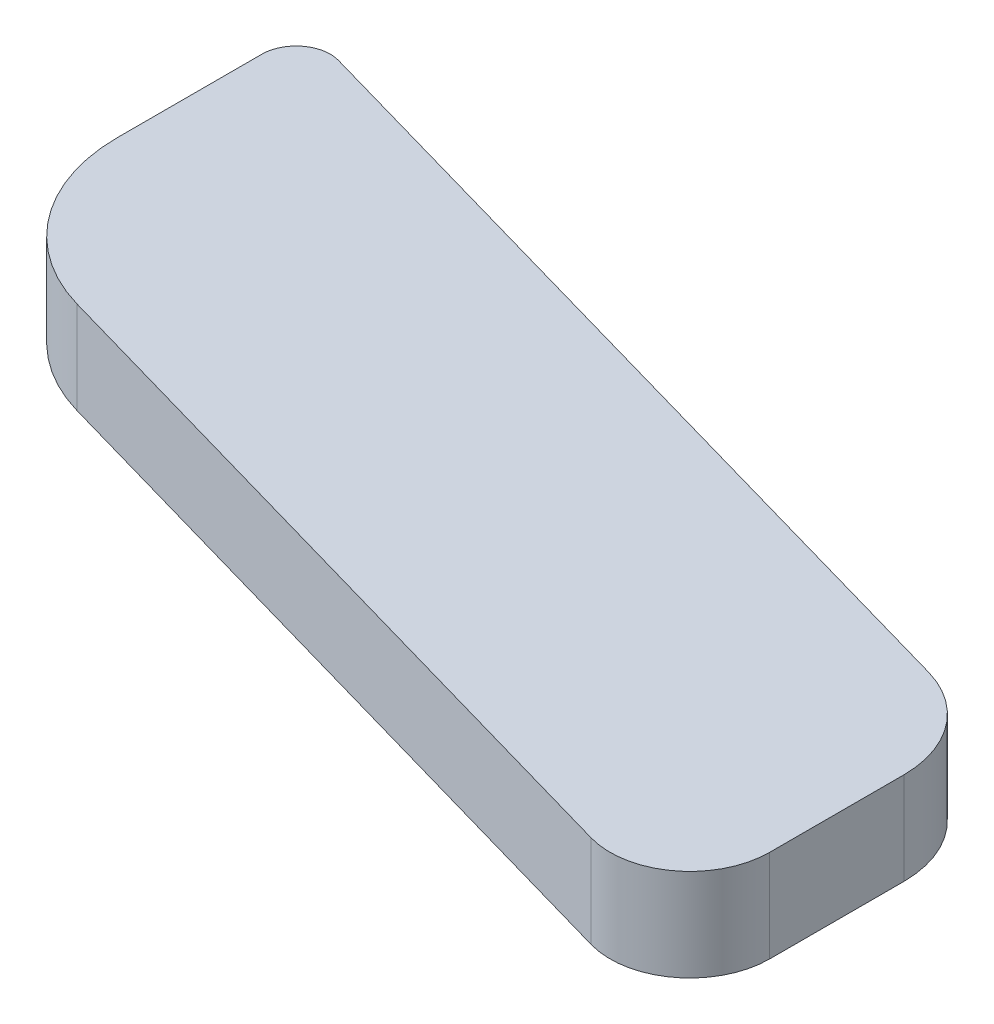
ISO-10303-21;
HEADER;
FILE_DESCRIPTION(('STEP AP214'),'2;1');
FILE_NAME('part.step','',(''),(''),'','','');
FILE_SCHEMA(('AUTOMOTIVE_DESIGN { 1 0 10303 214 1 1 1 1 }'));
ENDSEC;
DATA;
#1=APPLICATION_CONTEXT('core data for automotive mechanical design processes');
#2=APPLICATION_PROTOCOL_DEFINITION('international standard','automotive_design',2000,#1);
#3=PRODUCT_CONTEXT('',#1,'mechanical');
#4=PRODUCT('Part','Part','',(#3));
#5=PRODUCT_RELATED_PRODUCT_CATEGORY('part','',(#4));
#6=PRODUCT_DEFINITION_FORMATION('','',#4);
#7=PRODUCT_DEFINITION_CONTEXT('part definition',#1,'design');
#8=PRODUCT_DEFINITION('design','',#6,#7);
#9=PRODUCT_DEFINITION_SHAPE('','',#8);
#10=(LENGTH_UNIT() NAMED_UNIT(*) SI_UNIT(.MILLI.,.METRE.));
#11=(NAMED_UNIT(*) PLANE_ANGLE_UNIT() SI_UNIT($,.RADIAN.));
#12=(NAMED_UNIT(*) SI_UNIT($,.STERADIAN.) SOLID_ANGLE_UNIT());
#13=UNCERTAINTY_MEASURE_WITH_UNIT(LENGTH_MEASURE(1.E-05),#10,'distance_accuracy_value','');
#14=(GEOMETRIC_REPRESENTATION_CONTEXT(3) GLOBAL_UNCERTAINTY_ASSIGNED_CONTEXT((#13)) GLOBAL_UNIT_ASSIGNED_CONTEXT((#10,
#11,#12)) REPRESENTATION_CONTEXT('',''));
#15=CARTESIAN_POINT('',(0.,0.,0.));
#16=DIRECTION('',(0.,0.,1.));
#17=DIRECTION('',(1.,0.,0.));
#18=AXIS2_PLACEMENT_3D('',#15,#16,#17);
#19=CARTESIAN_POINT('',(-0.721252074815928,2.9906,0.232990299906857));
#20=DIRECTION('',(0.,-1.,0.));
#21=DIRECTION('',(-1.,0.,0.));
#22=AXIS2_PLACEMENT_3D('',#19,#20,#21);
#23=CYLINDRICAL_SURFACE('',#22,0.111091614503659);
#24=CARTESIAN_POINT('',(-0.721252074815928,2.9906,0.232990299906857));
#25=DIRECTION('',(0.,1.,0.));
#26=DIRECTION('',(1.,0.,0.));
#27=AXIS2_PLACEMENT_3D('',#24,#25,#26);
#28=CIRCLE('',#27,0.111091614503659);
#29=CARTESIAN_POINT('',(-0.832343689319588,2.9906,0.232990299906857));
#30=VERTEX_POINT('',#29);
#31=CARTESIAN_POINT('',(-0.75173687021393,2.9906,0.339817375419443));
#32=VERTEX_POINT('',#31);
#33=EDGE_CURVE('E11',#30,#32,#28,.T.);
#34=ORIENTED_EDGE('',*,*,#33,.F.);
#35=DIRECTION('',(0.,-1.,0.));
#36=VECTOR('',#35,1.);
#37=CARTESIAN_POINT('',(-0.832343689319588,2.9906,0.232990299906857));
#38=LINE('',#37,#36);
#39=CARTESIAN_POINT('',(-0.832343689319588,2.9306,0.232990299906857));
#40=VERTEX_POINT('',#39);
#41=EDGE_CURVE('E24',#30,#40,#38,.T.);
#42=ORIENTED_EDGE('',*,*,#41,.T.);
#43=CARTESIAN_POINT('',(-0.721252074815928,2.9306,0.232990299906857));
#44=DIRECTION('',(0.,1.,0.));
#45=DIRECTION('',(1.,0.,0.));
#46=AXIS2_PLACEMENT_3D('',#43,#44,#45);
#47=CIRCLE('',#46,0.111091614503659);
#48=CARTESIAN_POINT('',(-0.75173687021393,2.9306,0.339817375419443));
#49=VERTEX_POINT('',#48);
#50=EDGE_CURVE('E157',#40,#49,#47,.T.);
#51=ORIENTED_EDGE('',*,*,#50,.T.);
#52=DIRECTION('',(0.,-1.,0.));
#53=VECTOR('',#52,1.);
#54=CARTESIAN_POINT('',(-0.75173687021393,2.9906,0.339817375419443));
#55=LINE('',#54,#53);
#56=EDGE_CURVE('E154',#32,#49,#55,.T.);
#57=ORIENTED_EDGE('',*,*,#56,.F.);
#58=EDGE_LOOP('',(#34,#42,#51,#57));
#59=FACE_BOUND('',#58,.T.);
#60=ADVANCED_FACE('F17',(#59),#23,.T.);
#61=CARTESIAN_POINT('',(-0.286722062113019,2.9906,0.336160147220718));
#62=DIRECTION('',(0.,-1.,0.));
#63=DIRECTION('',(-1.,0.,0.));
#64=AXIS2_PLACEMENT_3D('',#61,#62,#63);
#65=CYLINDRICAL_SURFACE('',#64,0.0684324345343284);
#66=CARTESIAN_POINT('',(-0.286722062113019,2.9306,0.336160147220718));
#67=DIRECTION('',(0.,1.,0.));
#68=DIRECTION('',(1.,0.,0.));
#69=AXIS2_PLACEMENT_3D('',#66,#67,#68);
#70=CIRCLE('',#69,0.0684324345343284);
#71=CARTESIAN_POINT('',(-0.218289627578691,2.9306,0.336160147220688));
#72=VERTEX_POINT('',#71);
#73=CARTESIAN_POINT('',(-0.26798909429343,2.9306,0.270341654280167));
#74=VERTEX_POINT('',#73);
#75=EDGE_CURVE('E152',#72,#74,#70,.T.);
#76=ORIENTED_EDGE('',*,*,#75,.T.);
#77=DIRECTION('',(0.,-1.,0.));
#78=VECTOR('',#77,1.);
#79=CARTESIAN_POINT('',(-0.26798909429343,2.9906,0.270341654280167));
#80=LINE('',#79,#78);
#81=CARTESIAN_POINT('',(-0.26798909429343,2.9906,0.270341654280167));
#82=VERTEX_POINT('',#81);
#83=EDGE_CURVE('E149',#82,#74,#80,.T.);
#84=ORIENTED_EDGE('',*,*,#83,.F.);
#85=CARTESIAN_POINT('',(-0.286722062113019,2.9906,0.336160147220718));
#86=DIRECTION('',(0.,1.,0.));
#87=DIRECTION('',(1.,0.,0.));
#88=AXIS2_PLACEMENT_3D('',#85,#86,#87);
#89=CIRCLE('',#88,0.0684324345343284);
#90=CARTESIAN_POINT('',(-0.218289627578691,2.9906,0.336160147220688));
#91=VERTEX_POINT('',#90);
#92=EDGE_CURVE('E147',#91,#82,#89,.T.);
#93=ORIENTED_EDGE('',*,*,#92,.F.);
#94=DIRECTION('',(0.,-1.,0.));
#95=VECTOR('',#94,1.);
#96=CARTESIAN_POINT('',(-0.218289627578691,2.9906,0.336160147220688));
#97=LINE('',#96,#95);
#98=EDGE_CURVE('E107',#91,#72,#97,.T.);
#99=ORIENTED_EDGE('',*,*,#98,.T.);
#100=EDGE_LOOP('',(#76,#84,#93,#99));
#101=FACE_BOUND('',#100,.T.);
#102=ADVANCED_FACE('F179',(#101),#65,.T.);
#103=CARTESIAN_POINT('',(-0.26798909429343,2.9906,0.270341654280167));
#104=DIRECTION('',(-0.273743992115519,0.,0.96180259241731));
#105=DIRECTION('',(0.96180259241731,0.,0.273743992115519));
#106=AXIS2_PLACEMENT_3D('',#103,#104,#105);
#107=PLANE('',#106);
#108=DIRECTION('',(-0.96180259241731,0.,-0.273743992115519));
#109=VECTOR('',#108,1.);
#110=CARTESIAN_POINT('',(-0.26798909429343,2.9306,0.270341654280167));
#111=LINE('',#110,#109);
#112=CARTESIAN_POINT('',(-0.804033523518037,2.9306,0.117775064042113));
#113=VERTEX_POINT('',#112);
#114=EDGE_CURVE('E144',#74,#113,#111,.T.);
#115=ORIENTED_EDGE('',*,*,#114,.T.);
#116=DIRECTION('',(0.,-1.,0.));
#117=VECTOR('',#116,1.);
#118=CARTESIAN_POINT('',(-0.804033523518037,2.9906,0.117775064042113));
#119=LINE('',#118,#117);
#120=CARTESIAN_POINT('',(-0.804033523518037,2.9906,0.117775064042113));
#121=VERTEX_POINT('',#120);
#122=EDGE_CURVE('E141',#121,#113,#119,.T.);
#123=ORIENTED_EDGE('',*,*,#122,.F.);
#124=DIRECTION('',(-0.96180259241731,0.,-0.273743992115519));
#125=VECTOR('',#124,1.);
#126=CARTESIAN_POINT('',(-0.26798909429343,2.9906,0.270341654280167));
#127=LINE('',#126,#125);
#128=EDGE_CURVE('E138',#82,#121,#127,.T.);
#129=ORIENTED_EDGE('',*,*,#128,.F.);
#130=ORIENTED_EDGE('',*,*,#83,.T.);
#131=EDGE_LOOP('',(#115,#123,#129,#130));
#132=FACE_BOUND('',#131,.T.);
#133=ADVANCED_FACE('F177',(#132),#107,.F.);
#134=CARTESIAN_POINT('',(-0.810115655926985,2.9906,0.139144704607261));
#135=DIRECTION('',(0.,-1.,0.));
#136=DIRECTION('',(-1.,0.,0.));
#137=AXIS2_PLACEMENT_3D('',#134,#135,#136);
#138=CYLINDRICAL_SURFACE('',#137,0.022218322900786);
#139=CARTESIAN_POINT('',(-0.810115655926985,2.9306,0.139144704607261));
#140=DIRECTION('',(0.,1.,0.));
#141=DIRECTION('',(1.,0.,0.));
#142=AXIS2_PLACEMENT_3D('',#139,#140,#141);
#143=CIRCLE('',#142,0.022218322900786);
#144=CARTESIAN_POINT('',(-0.832333978708818,2.9306,0.139142405496553));
#145=VERTEX_POINT('',#144);
#146=EDGE_CURVE('E136',#113,#145,#143,.T.);
#147=ORIENTED_EDGE('',*,*,#146,.T.);
#148=DIRECTION('',(0.,-1.,0.));
#149=VECTOR('',#148,1.);
#150=CARTESIAN_POINT('',(-0.832333978708818,2.9906,0.139142405496553));
#151=LINE('',#150,#149);
#152=CARTESIAN_POINT('',(-0.832333978708818,2.9906,0.139142405496553));
#153=VERTEX_POINT('',#152);
#154=EDGE_CURVE('E133',#153,#145,#151,.T.);
#155=ORIENTED_EDGE('',*,*,#154,.F.);
#156=CARTESIAN_POINT('',(-0.810115655926985,2.9906,0.139144704607261));
#157=DIRECTION('',(0.,1.,0.));
#158=DIRECTION('',(1.,0.,0.));
#159=AXIS2_PLACEMENT_3D('',#156,#157,#158);
#160=CIRCLE('',#159,0.022218322900786);
#161=EDGE_CURVE('E130',#121,#153,#160,.T.);
#162=ORIENTED_EDGE('',*,*,#161,.F.);
#163=ORIENTED_EDGE('',*,*,#122,.T.);
#164=EDGE_LOOP('',(#147,#155,#162,#163));
#165=FACE_BOUND('',#164,.T.);
#166=ADVANCED_FACE('F173',(#165),#138,.T.);
#167=CARTESIAN_POINT('',(-0.832333978708818,2.9906,0.139142405496553));
#168=DIRECTION('',(0.999999994646137,0.,0.000103478139249879));
#169=DIRECTION('',(0.000103478139249879,0.,-0.999999994646137));
#170=AXIS2_PLACEMENT_3D('',#167,#168,#169);
#171=PLANE('',#170);
#172=DIRECTION('',(-0.000103478139249879,0.,0.999999994646137));
#173=VECTOR('',#172,1.);
#174=CARTESIAN_POINT('',(-0.832333978708818,2.9306,0.139142405496553));
#175=LINE('',#174,#173);
#176=CARTESIAN_POINT('',(-0.832343688724818,2.9306,0.232978804353251));
#177=VERTEX_POINT('',#176);
#178=EDGE_CURVE('E128',#145,#177,#175,.T.);
#179=ORIENTED_EDGE('',*,*,#178,.T.);
#180=DIRECTION('',(0.,-1.,0.));
#181=VECTOR('',#180,1.);
#182=CARTESIAN_POINT('',(-0.832343688724818,2.9906,0.232978804353251));
#183=LINE('',#182,#181);
#184=CARTESIAN_POINT('',(-0.832343688724818,2.9906,0.232978804353251));
#185=VERTEX_POINT('',#184);
#186=EDGE_CURVE('E125',#185,#177,#183,.T.);
#187=ORIENTED_EDGE('',*,*,#186,.F.);
#188=DIRECTION('',(-0.000103478139249879,0.,0.999999994646137));
#189=VECTOR('',#188,1.);
#190=CARTESIAN_POINT('',(-0.832333978708818,2.9906,0.139142405496553));
#191=LINE('',#190,#189);
#192=EDGE_CURVE('E122',#153,#185,#191,.T.);
#193=ORIENTED_EDGE('',*,*,#192,.F.);
#194=ORIENTED_EDGE('',*,*,#154,.T.);
#195=EDGE_LOOP('',(#179,#187,#193,#194));
#196=FACE_BOUND('',#195,.T.);
#197=ADVANCED_FACE('F169',(#196),#171,.F.);
#198=CARTESIAN_POINT('',(-0.721252074815928,2.9906,0.232990299906857));
#199=DIRECTION('',(0.,-1.,0.));
#200=DIRECTION('',(-1.,0.,0.));
#201=AXIS2_PLACEMENT_3D('',#198,#199,#200);
#202=CYLINDRICAL_SURFACE('',#201,0.111091614503659);
#203=ORIENTED_EDGE('',*,*,#41,.F.);
#204=CARTESIAN_POINT('',(-0.721252074815928,2.9906,0.232990299906857));
#205=DIRECTION('',(0.,1.,0.));
#206=DIRECTION('',(1.,0.,0.));
#207=AXIS2_PLACEMENT_3D('',#204,#205,#206);
#208=CIRCLE('',#207,0.111091614503659);
#209=EDGE_CURVE('E120',#185,#30,#208,.T.);
#210=ORIENTED_EDGE('',*,*,#209,.F.);
#211=ORIENTED_EDGE('',*,*,#186,.T.);
#212=CARTESIAN_POINT('',(-0.721252074815928,2.9306,0.232990299906857));
#213=DIRECTION('',(0.,1.,0.));
#214=DIRECTION('',(1.,0.,0.));
#215=AXIS2_PLACEMENT_3D('',#212,#213,#214);
#216=CIRCLE('',#215,0.111091614503659);
#217=EDGE_CURVE('E117',#177,#40,#216,.T.);
#218=ORIENTED_EDGE('',*,*,#217,.T.);
#219=EDGE_LOOP('',(#203,#210,#211,#218));
#220=FACE_BOUND('',#219,.T.);
#221=ADVANCED_FACE('F166',(#220),#202,.T.);
#222=CARTESIAN_POINT('',(-0.75173687021393,2.9906,0.339817375419443));
#223=DIRECTION('',(0.274411309388077,0.,-0.961612413230986));
#224=DIRECTION('',(-0.961612413230986,0.,-0.274411309388077));
#225=AXIS2_PLACEMENT_3D('',#222,#223,#224);
#226=PLANE('',#225);
#227=DIRECTION('',(0.961612413230986,0.,0.274411309388077));
#228=VECTOR('',#227,1.);
#229=CARTESIAN_POINT('',(-0.75173687021393,2.9306,0.339817375419443));
#230=LINE('',#229,#228);
#231=CARTESIAN_POINT('',(-0.284358618866149,2.9306,0.47319115072349));
#232=VERTEX_POINT('',#231);
#233=EDGE_CURVE('E115',#49,#232,#230,.T.);
#234=ORIENTED_EDGE('',*,*,#233,.T.);
#235=DIRECTION('',(0.,-1.,0.));
#236=VECTOR('',#235,1.);
#237=CARTESIAN_POINT('',(-0.284358618866149,2.9906,0.47319115072349));
#238=LINE('',#237,#236);
#239=CARTESIAN_POINT('',(-0.284358618866149,2.9906,0.47319115072349));
#240=VERTEX_POINT('',#239);
#241=EDGE_CURVE('E113',#240,#232,#238,.T.);
#242=ORIENTED_EDGE('',*,*,#241,.F.);
#243=DIRECTION('',(0.961612413230986,0.,0.274411309388077));
#244=VECTOR('',#243,1.);
#245=CARTESIAN_POINT('',(-0.75173687021393,2.9906,0.339817375419443));
#246=LINE('',#245,#244);
#247=EDGE_CURVE('E101',#32,#240,#246,.T.);
#248=ORIENTED_EDGE('',*,*,#247,.F.);
#249=ORIENTED_EDGE('',*,*,#56,.T.);
#250=EDGE_LOOP('',(#234,#242,#248,#249));
#251=FACE_BOUND('',#250,.T.);
#252=ADVANCED_FACE('F194',(#251),#226,.F.);
#253=CARTESIAN_POINT('',(-0.270132381013753,2.9906,0.423338515484257));
#254=DIRECTION('',(0.,-1.,0.));
#255=DIRECTION('',(-1.,0.,0.));
#256=AXIS2_PLACEMENT_3D('',#253,#254,#255);
#257=CYLINDRICAL_SURFACE('',#256,0.0518427534350651);
#258=CARTESIAN_POINT('',(-0.270132381013753,2.9306,0.423338515484257));
#259=DIRECTION('',(0.,1.,0.));
#260=DIRECTION('',(1.,0.,0.));
#261=AXIS2_PLACEMENT_3D('',#258,#259,#260);
#262=CIRCLE('',#261,0.0518427534350651);
#263=CARTESIAN_POINT('',(-0.218289627578691,2.9306,0.42333851548424));
#264=VERTEX_POINT('',#263);
#265=EDGE_CURVE('E90',#232,#264,#262,.T.);
#266=ORIENTED_EDGE('',*,*,#265,.T.);
#267=DIRECTION('',(0.,-1.,0.));
#268=VECTOR('',#267,1.);
#269=CARTESIAN_POINT('',(-0.218289627578691,2.9906,0.42333851548424));
#270=LINE('',#269,#268);
#271=CARTESIAN_POINT('',(-0.218289627578691,2.9906,0.42333851548424));
#272=VERTEX_POINT('',#271);
#273=EDGE_CURVE('E84',#272,#264,#270,.T.);
#274=ORIENTED_EDGE('',*,*,#273,.F.);
#275=CARTESIAN_POINT('',(-0.270132381013753,2.9906,0.423338515484257));
#276=DIRECTION('',(0.,1.,0.));
#277=DIRECTION('',(1.,0.,0.));
#278=AXIS2_PLACEMENT_3D('',#275,#276,#277);
#279=CIRCLE('',#278,0.0518427534350651);
#280=EDGE_CURVE('E88',#240,#272,#279,.T.);
#281=ORIENTED_EDGE('',*,*,#280,.F.);
#282=ORIENTED_EDGE('',*,*,#241,.T.);
#283=EDGE_LOOP('',(#266,#274,#281,#282));
#284=FACE_BOUND('',#283,.T.);
#285=ADVANCED_FACE('F86',(#284),#257,.T.);
#286=CARTESIAN_POINT('',(-0.218289627578691,2.9906,0.42333851548424));
#287=DIRECTION('',(-1.,0.,0.));
#288=DIRECTION('',(0.,1.,0.));
#289=AXIS2_PLACEMENT_3D('',#286,#287,#288);
#290=PLANE('',#289);
#291=DIRECTION('',(0.,0.,-1.));
#292=VECTOR('',#291,1.);
#293=CARTESIAN_POINT('',(-0.218289627578691,2.9306,0.42333851548424));
#294=LINE('',#293,#292);
#295=EDGE_CURVE('E102',#264,#72,#294,.T.);
#296=ORIENTED_EDGE('',*,*,#295,.T.);
#297=ORIENTED_EDGE('',*,*,#98,.F.);
#298=DIRECTION('',(0.,0.,-1.));
#299=VECTOR('',#298,1.);
#300=CARTESIAN_POINT('',(-0.218289627578691,2.9906,0.42333851548424));
#301=LINE('',#300,#299);
#302=EDGE_CURVE('E99',#272,#91,#301,.T.);
#303=ORIENTED_EDGE('',*,*,#302,.F.);
#304=ORIENTED_EDGE('',*,*,#273,.T.);
#305=EDGE_LOOP('',(#296,#297,#303,#304));
#306=FACE_BOUND('',#305,.T.);
#307=ADVANCED_FACE('F105',(#306),#290,.F.);
#308=CARTESIAN_POINT('',(-0.286722062113019,2.9906,0.336160147220718));
#309=DIRECTION('',(0.,1.,0.));
#310=DIRECTION('',(1.,0.,0.));
#311=AXIS2_PLACEMENT_3D('',#308,#309,#310);
#312=PLANE('',#311);
#313=ORIENTED_EDGE('',*,*,#92,.T.);
#314=ORIENTED_EDGE('',*,*,#128,.T.);
#315=ORIENTED_EDGE('',*,*,#161,.T.);
#316=ORIENTED_EDGE('',*,*,#192,.T.);
#317=ORIENTED_EDGE('',*,*,#209,.T.);
#318=ORIENTED_EDGE('',*,*,#33,.T.);
#319=ORIENTED_EDGE('',*,*,#247,.T.);
#320=ORIENTED_EDGE('',*,*,#280,.T.);
#321=ORIENTED_EDGE('',*,*,#302,.T.);
#322=EDGE_LOOP('',(#313,#314,#315,#316,#317,#318,#319,#320,#321));
#323=FACE_BOUND('',#322,.T.);
#324=ADVANCED_FACE('F98',(#323),#312,.T.);
#325=CARTESIAN_POINT('',(-0.286722062113019,2.9306,0.336160147220718));
#326=DIRECTION('',(0.,1.,0.));
#327=DIRECTION('',(1.,0.,0.));
#328=AXIS2_PLACEMENT_3D('',#325,#326,#327);
#329=PLANE('',#328);
#330=ORIENTED_EDGE('',*,*,#75,.F.);
#331=ORIENTED_EDGE('',*,*,#295,.F.);
#332=ORIENTED_EDGE('',*,*,#265,.F.);
#333=ORIENTED_EDGE('',*,*,#233,.F.);
#334=ORIENTED_EDGE('',*,*,#50,.F.);
#335=ORIENTED_EDGE('',*,*,#217,.F.);
#336=ORIENTED_EDGE('',*,*,#178,.F.);
#337=ORIENTED_EDGE('',*,*,#146,.F.);
#338=ORIENTED_EDGE('',*,*,#114,.F.);
#339=EDGE_LOOP('',(#330,#331,#332,#333,#334,#335,#336,#337,#338));
#340=FACE_BOUND('',#339,.T.);
#341=ADVANCED_FACE('F164',(#340),#329,.F.);
#342=CLOSED_SHELL('',(#60,#102,#133,#166,#197,#221,#252,#285,#307,#324,#341));
#343=MANIFOLD_SOLID_BREP('B1',#342);
#344=ADVANCED_BREP_SHAPE_REPRESENTATION('',(#18,#343),#14);
#345=SHAPE_DEFINITION_REPRESENTATION(#9,#344);
ENDSEC;
END-ISO-10303-21;
